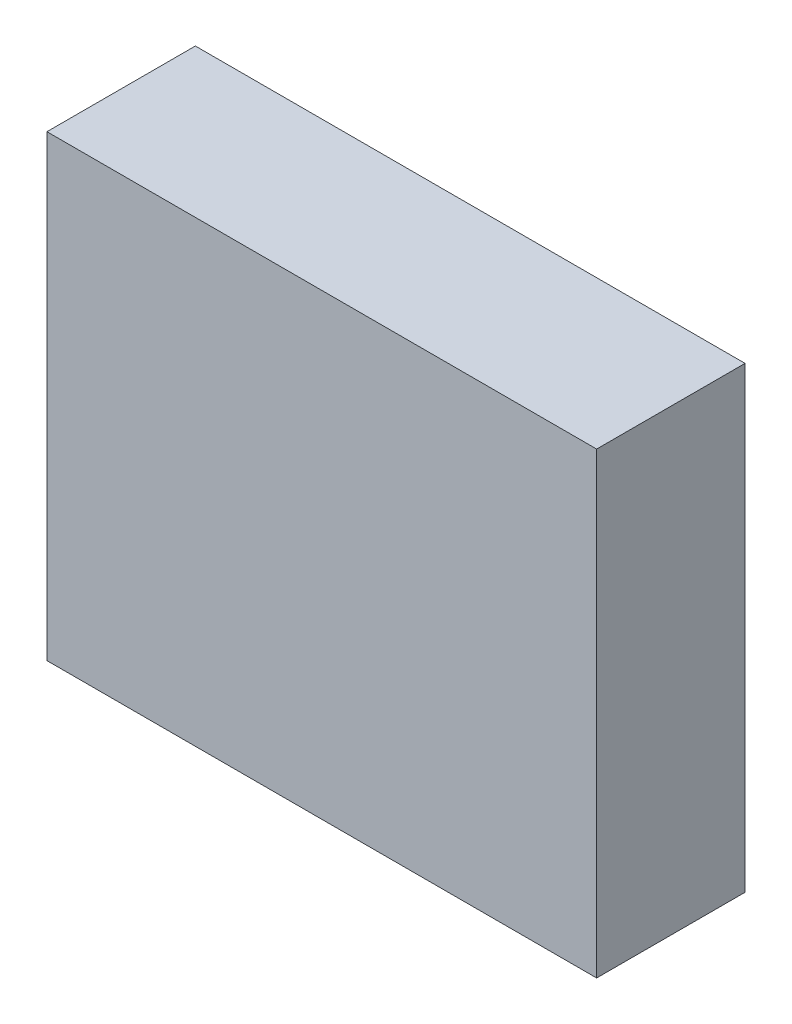
ISO-10303-21;
HEADER;
FILE_DESCRIPTION(('STEP AP214'),'2;1');
FILE_NAME('part.step','',(''),(''),'','','');
FILE_SCHEMA(('AUTOMOTIVE_DESIGN { 1 0 10303 214 1 1 1 1 }'));
ENDSEC;
DATA;
#1=APPLICATION_CONTEXT('core data for automotive mechanical design processes');
#2=APPLICATION_PROTOCOL_DEFINITION('international standard','automotive_design',2000,#1);
#3=PRODUCT_CONTEXT('',#1,'mechanical');
#4=PRODUCT('Part','Part','',(#3));
#5=PRODUCT_RELATED_PRODUCT_CATEGORY('part','',(#4));
#6=PRODUCT_DEFINITION_FORMATION('','',#4);
#7=PRODUCT_DEFINITION_CONTEXT('part definition',#1,'design');
#8=PRODUCT_DEFINITION('design','',#6,#7);
#9=PRODUCT_DEFINITION_SHAPE('','',#8);
#10=(LENGTH_UNIT() NAMED_UNIT(*) SI_UNIT(.MILLI.,.METRE.));
#11=(NAMED_UNIT(*) PLANE_ANGLE_UNIT() SI_UNIT($,.RADIAN.));
#12=(NAMED_UNIT(*) SI_UNIT($,.STERADIAN.) SOLID_ANGLE_UNIT());
#13=UNCERTAINTY_MEASURE_WITH_UNIT(LENGTH_MEASURE(1.E-05),#10,'distance_accuracy_value','');
#14=(GEOMETRIC_REPRESENTATION_CONTEXT(3) GLOBAL_UNCERTAINTY_ASSIGNED_CONTEXT((#13)) GLOBAL_UNIT_ASSIGNED_CONTEXT((#10,
#11,#12)) REPRESENTATION_CONTEXT('',''));
#15=CARTESIAN_POINT('',(0.,0.,0.));
#16=DIRECTION('',(0.,0.,1.));
#17=DIRECTION('',(1.,0.,0.));
#18=AXIS2_PLACEMENT_3D('',#15,#16,#17);
#19=CARTESIAN_POINT('',(6.099999936578E-07,-6.599999977652E-07,0.860000820162));
#20=DIRECTION('',(0.,0.,1.));
#21=DIRECTION('',(1.,0.,0.));
#22=AXIS2_PLACEMENT_3D('',#19,#20,#21);
#23=PLANE('',#22);
#24=DIRECTION('',(0.,1.,0.));
#25=VECTOR('',#24,1.);
#26=CARTESIAN_POINT('',(1.50000142,-1.2500007,0.860000820162));
#27=LINE('',#26,#25);
#28=CARTESIAN_POINT('',(1.50000142,-1.2500007,0.860000820162));
#29=VERTEX_POINT('',#28);
#30=CARTESIAN_POINT('',(1.50000142,1.24999938,0.860000820162));
#31=VERTEX_POINT('',#30);
#32=EDGE_CURVE('E76',#29,#31,#27,.T.);
#33=ORIENTED_EDGE('',*,*,#32,.T.);
#34=DIRECTION('',(1.,0.,0.));
#35=VECTOR('',#34,1.);
#36=CARTESIAN_POINT('',(1.50000142,1.24999938,0.860000820162));
#37=LINE('',#36,#35);
#38=CARTESIAN_POINT('',(-1.5000002,1.24999938,0.860000820162));
#39=VERTEX_POINT('',#38);
#40=EDGE_CURVE('E58',#31,#39,#37,.F.);
#41=ORIENTED_EDGE('',*,*,#40,.T.);
#42=DIRECTION('',(0.,1.,0.));
#43=VECTOR('',#42,1.);
#44=CARTESIAN_POINT('',(-1.5000002,1.24999938,0.860000820162));
#45=LINE('',#44,#43);
#46=CARTESIAN_POINT('',(-1.5000002,-1.2500007,0.860000820162));
#47=VERTEX_POINT('',#46);
#48=EDGE_CURVE('E20',#39,#47,#45,.F.);
#49=ORIENTED_EDGE('',*,*,#48,.T.);
#50=DIRECTION('',(1.,0.,0.));
#51=VECTOR('',#50,1.);
#52=CARTESIAN_POINT('',(-1.5000002,-1.2500007,0.860000820162));
#53=LINE('',#52,#51);
#54=EDGE_CURVE('E55',#47,#29,#53,.T.);
#55=ORIENTED_EDGE('',*,*,#54,.T.);
#56=EDGE_LOOP('',(#33,#41,#49,#55));
#57=FACE_BOUND('',#56,.T.);
#58=ADVANCED_FACE('F17',(#57),#23,.T.);
#59=CARTESIAN_POINT('',(-1.5000002,1.24999938,0.04999990016222));
#60=DIRECTION('',(1.,0.,0.));
#61=DIRECTION('',(0.,0.,-1.));
#62=AXIS2_PLACEMENT_3D('',#59,#60,#61);
#63=PLANE('',#62);
#64=DIRECTION('',(0.,0.,1.));
#65=VECTOR('',#64,1.);
#66=CARTESIAN_POINT('',(-1.5000002,-1.2500007,0.04999990016222));
#67=LINE('',#66,#65);
#68=CARTESIAN_POINT('',(-1.5000002,-1.2500007,0.04999990016222));
#69=VERTEX_POINT('',#68);
#70=EDGE_CURVE('E63',#69,#47,#67,.T.);
#71=ORIENTED_EDGE('',*,*,#70,.T.);
#72=ORIENTED_EDGE('',*,*,#48,.F.);
#73=DIRECTION('',(0.,0.,-1.));
#74=VECTOR('',#73,1.);
#75=CARTESIAN_POINT('',(-1.5000002,1.24999938,0.04999990016222));
#76=LINE('',#75,#74);
#77=CARTESIAN_POINT('',(-1.5000002,1.24999938,0.04999990016222));
#78=VERTEX_POINT('',#77);
#79=EDGE_CURVE('E80',#39,#78,#76,.T.);
#80=ORIENTED_EDGE('',*,*,#79,.T.);
#81=DIRECTION('',(0.,1.,0.));
#82=VECTOR('',#81,1.);
#83=CARTESIAN_POINT('',(-1.5000002,-6.599999977652E-07,0.04999990016222));
#84=LINE('',#83,#82);
#85=EDGE_CURVE('E73',#78,#69,#84,.F.);
#86=ORIENTED_EDGE('',*,*,#85,.T.);
#87=EDGE_LOOP('',(#71,#72,#80,#86));
#88=FACE_BOUND('',#87,.T.);
#89=ADVANCED_FACE('F72',(#88),#63,.F.);
#90=CARTESIAN_POINT('',(-1.5000002,-1.2500007,0.04999990016222));
#91=DIRECTION('',(0.,1.,0.));
#92=DIRECTION('',(0.,0.,1.));
#93=AXIS2_PLACEMENT_3D('',#90,#91,#92);
#94=PLANE('',#93);
#95=DIRECTION('',(0.,0.,1.));
#96=VECTOR('',#95,1.);
#97=CARTESIAN_POINT('',(1.50000142,-1.2500007,0.04999990016222));
#98=LINE('',#97,#96);
#99=CARTESIAN_POINT('',(1.50000142,-1.2500007,0.04999990016222));
#100=VERTEX_POINT('',#99);
#101=EDGE_CURVE('E69',#100,#29,#98,.T.);
#102=ORIENTED_EDGE('',*,*,#101,.T.);
#103=ORIENTED_EDGE('',*,*,#54,.F.);
#104=ORIENTED_EDGE('',*,*,#70,.F.);
#105=DIRECTION('',(1.,0.,0.));
#106=VECTOR('',#105,1.);
#107=CARTESIAN_POINT('',(6.099999936578E-07,-1.2500007,0.04999990016222));
#108=LINE('',#107,#106);
#109=EDGE_CURVE('E83',#69,#100,#108,.T.);
#110=ORIENTED_EDGE('',*,*,#109,.T.);
#111=EDGE_LOOP('',(#102,#103,#104,#110));
#112=FACE_BOUND('',#111,.T.);
#113=ADVANCED_FACE('F66',(#112),#94,.F.);
#114=CARTESIAN_POINT('',(1.50000142,-1.2500007,0.04999990016222));
#115=DIRECTION('',(-1.,0.,0.));
#116=DIRECTION('',(0.,0.,1.));
#117=AXIS2_PLACEMENT_3D('',#114,#115,#116);
#118=PLANE('',#117);
#119=DIRECTION('',(0.,0.,-1.));
#120=VECTOR('',#119,1.);
#121=CARTESIAN_POINT('',(1.50000142,1.24999938,0.04999990016222));
#122=LINE('',#121,#120);
#123=CARTESIAN_POINT('',(1.50000142,1.24999938,0.04999990016222));
#124=VERTEX_POINT('',#123);
#125=EDGE_CURVE('E34',#124,#31,#122,.F.);
#126=ORIENTED_EDGE('',*,*,#125,.T.);
#127=ORIENTED_EDGE('',*,*,#32,.F.);
#128=ORIENTED_EDGE('',*,*,#101,.F.);
#129=DIRECTION('',(0.,1.,0.));
#130=VECTOR('',#129,1.);
#131=CARTESIAN_POINT('',(1.50000142,-6.599999977652E-07,0.04999990016222));
#132=LINE('',#131,#130);
#133=EDGE_CURVE('E26',#100,#124,#132,.T.);
#134=ORIENTED_EDGE('',*,*,#133,.T.);
#135=EDGE_LOOP('',(#126,#127,#128,#134));
#136=FACE_BOUND('',#135,.T.);
#137=ADVANCED_FACE('F88',(#136),#118,.F.);
#138=CARTESIAN_POINT('',(1.50000142,1.24999938,0.04999990016222));
#139=DIRECTION('',(0.,-1.,0.));
#140=DIRECTION('',(0.,0.,-1.));
#141=AXIS2_PLACEMENT_3D('',#138,#139,#140);
#142=PLANE('',#141);
#143=ORIENTED_EDGE('',*,*,#79,.F.);
#144=ORIENTED_EDGE('',*,*,#40,.F.);
#145=ORIENTED_EDGE('',*,*,#125,.F.);
#146=DIRECTION('',(1.,0.,0.));
#147=VECTOR('',#146,1.);
#148=CARTESIAN_POINT('',(6.099999936578E-07,1.24999938,0.04999990016222));
#149=LINE('',#148,#147);
#150=EDGE_CURVE('E11',#124,#78,#149,.F.);
#151=ORIENTED_EDGE('',*,*,#150,.T.);
#152=EDGE_LOOP('',(#143,#144,#145,#151));
#153=FACE_BOUND('',#152,.T.);
#154=ADVANCED_FACE('F91',(#153),#142,.F.);
#155=CARTESIAN_POINT('',(6.099999936578E-07,-6.599999977652E-07,0.04999990016222));
#156=DIRECTION('',(0.,0.,1.));
#157=DIRECTION('',(1.,0.,0.));
#158=AXIS2_PLACEMENT_3D('',#155,#156,#157);
#159=PLANE('',#158);
#160=ORIENTED_EDGE('',*,*,#133,.F.);
#161=ORIENTED_EDGE('',*,*,#109,.F.);
#162=ORIENTED_EDGE('',*,*,#85,.F.);
#163=ORIENTED_EDGE('',*,*,#150,.F.);
#164=EDGE_LOOP('',(#160,#161,#162,#163));
#165=FACE_BOUND('',#164,.T.);
#166=ADVANCED_FACE('F90',(#165),#159,.F.);
#167=CLOSED_SHELL('',(#58,#89,#113,#137,#154,#166));
#168=MANIFOLD_SOLID_BREP('B1',#167);
#169=ADVANCED_BREP_SHAPE_REPRESENTATION('',(#18,#168),#14);
#170=SHAPE_DEFINITION_REPRESENTATION(#9,#169);
ENDSEC;
END-ISO-10303-21;
